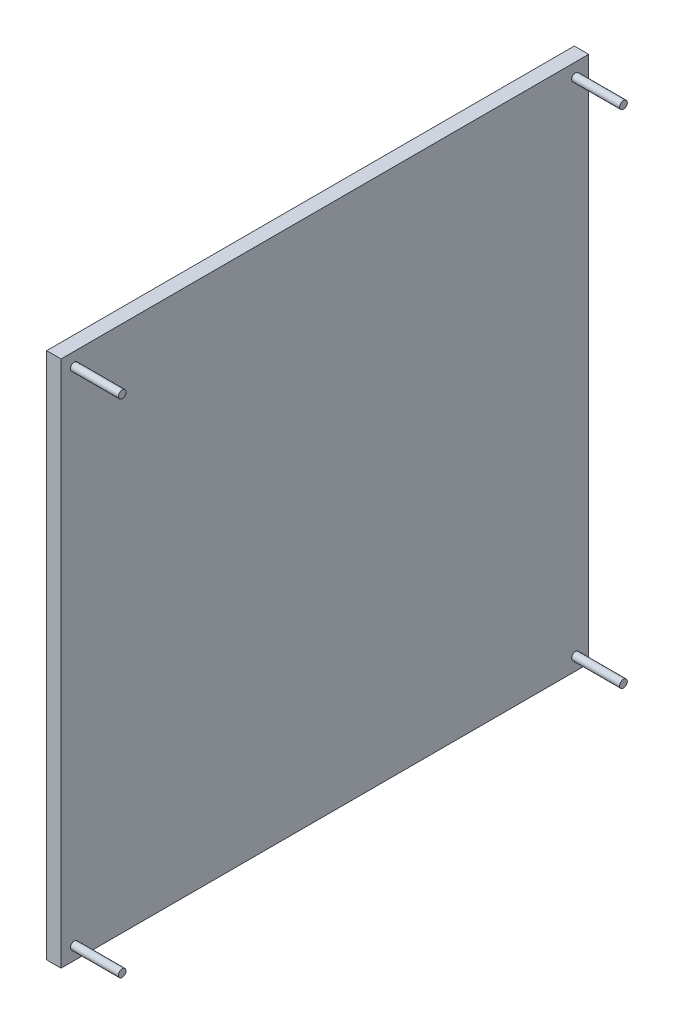
ISO-10303-21;
HEADER;
FILE_DESCRIPTION(('STEP AP214'),'2;1');
FILE_NAME('part.step','',(''),(''),'','','');
FILE_SCHEMA(('AUTOMOTIVE_DESIGN { 1 0 10303 214 1 1 1 1 }'));
ENDSEC;
DATA;
#1=APPLICATION_CONTEXT('core data for automotive mechanical design processes');
#2=APPLICATION_PROTOCOL_DEFINITION('international standard','automotive_design',2000,#1);
#3=PRODUCT_CONTEXT('',#1,'mechanical');
#4=PRODUCT('Part','Part','',(#3));
#5=PRODUCT_RELATED_PRODUCT_CATEGORY('part','',(#4));
#6=PRODUCT_DEFINITION_FORMATION('','',#4);
#7=PRODUCT_DEFINITION_CONTEXT('part definition',#1,'design');
#8=PRODUCT_DEFINITION('design','',#6,#7);
#9=PRODUCT_DEFINITION_SHAPE('','',#8);
#10=(LENGTH_UNIT() NAMED_UNIT(*) SI_UNIT(.MILLI.,.METRE.));
#11=(NAMED_UNIT(*) PLANE_ANGLE_UNIT() SI_UNIT($,.RADIAN.));
#12=(NAMED_UNIT(*) SI_UNIT($,.STERADIAN.) SOLID_ANGLE_UNIT());
#13=UNCERTAINTY_MEASURE_WITH_UNIT(LENGTH_MEASURE(1.E-05),#10,'distance_accuracy_value','');
#14=(GEOMETRIC_REPRESENTATION_CONTEXT(3) GLOBAL_UNCERTAINTY_ASSIGNED_CONTEXT((#13)) GLOBAL_UNIT_ASSIGNED_CONTEXT((#10,
#11,#12)) REPRESENTATION_CONTEXT('',''));
#15=CARTESIAN_POINT('',(0.,0.,0.));
#16=DIRECTION('',(0.,0.,1.));
#17=DIRECTION('',(1.,0.,0.));
#18=AXIS2_PLACEMENT_3D('',#15,#16,#17);
#19=CARTESIAN_POINT('',(6.,0.,0.));
#20=DIRECTION('',(-1.,0.,0.));
#21=DIRECTION('',(0.,0.,1.));
#22=AXIS2_PLACEMENT_3D('',#19,#20,#21);
#23=PLANE('',#22);
#24=DIRECTION('',(0.,1.,0.));
#25=VECTOR('',#24,1.);
#26=CARTESIAN_POINT('',(6.,125.424234720645,-86.795399092835));
#27=LINE('',#26,#25);
#28=CARTESIAN_POINT('',(6.,-94.575765279355,-86.795399092835));
#29=VERTEX_POINT('',#28);
#30=CARTESIAN_POINT('',(6.,125.424234720645,-86.795399092835));
#31=VERTEX_POINT('',#30);
#32=EDGE_CURVE('E86',#29,#31,#27,.T.);
#33=ORIENTED_EDGE('',*,*,#32,.T.);
#34=DIRECTION('',(0.,0.,1.));
#35=VECTOR('',#34,1.);
#36=CARTESIAN_POINT('',(6.,125.424234720645,-86.795399092835));
#37=LINE('',#36,#35);
#38=CARTESIAN_POINT('',(6.,125.424234720645,133.204600907165));
#39=VERTEX_POINT('',#38);
#40=EDGE_CURVE('E81',#31,#39,#37,.T.);
#41=ORIENTED_EDGE('',*,*,#40,.T.);
#42=DIRECTION('',(0.,-1.,0.));
#43=VECTOR('',#42,1.);
#44=CARTESIAN_POINT('',(6.,125.424234720645,133.204600907165));
#45=LINE('',#44,#43);
#46=CARTESIAN_POINT('',(6.,-94.575765279355,133.204600907165));
#47=VERTEX_POINT('',#46);
#48=EDGE_CURVE('E84',#39,#47,#45,.T.);
#49=ORIENTED_EDGE('',*,*,#48,.T.);
#50=DIRECTION('',(0.,0.,-1.));
#51=VECTOR('',#50,1.);
#52=CARTESIAN_POINT('',(6.,-94.575765279355,-86.795399092835));
#53=LINE('',#52,#51);
#54=EDGE_CURVE('E51',#47,#29,#53,.T.);
#55=ORIENTED_EDGE('',*,*,#54,.T.);
#56=EDGE_LOOP('',(#33,#41,#49,#55));
#57=FACE_BOUND('',#56,.T.);
#58=CARTESIAN_POINT('',(6.,119.924234720645,-81.295399092835));
#59=DIRECTION('',(1.,0.,0.));
#60=DIRECTION('',(0.,0.,-1.));
#61=AXIS2_PLACEMENT_3D('',#58,#59,#60);
#62=CIRCLE('',#61,1.60000000000002);
#63=CARTESIAN_POINT('',(6.,119.924234720645,-82.895399092835));
#64=VERTEX_POINT('',#63);
#65=EDGE_CURVE('E101',#64,#64,#62,.T.);
#66=ORIENTED_EDGE('',*,*,#65,.F.);
#67=EDGE_LOOP('',(#66));
#68=FACE_BOUND('',#67,.T.);
#69=CARTESIAN_POINT('',(6.,119.924234720645,127.704600907165));
#70=DIRECTION('',(1.,0.,0.));
#71=DIRECTION('',(0.,0.,-1.));
#72=AXIS2_PLACEMENT_3D('',#69,#70,#71);
#73=CIRCLE('',#72,1.60000000000002);
#74=CARTESIAN_POINT('',(6.,119.924234720645,126.104600907165));
#75=VERTEX_POINT('',#74);
#76=EDGE_CURVE('E114',#75,#75,#73,.T.);
#77=ORIENTED_EDGE('',*,*,#76,.F.);
#78=EDGE_LOOP('',(#77));
#79=FACE_BOUND('',#78,.T.);
#80=CARTESIAN_POINT('',(6.,-89.075765279355,127.704600907165));
#81=DIRECTION('',(1.,0.,0.));
#82=DIRECTION('',(0.,0.,-1.));
#83=AXIS2_PLACEMENT_3D('',#80,#81,#82);
#84=CIRCLE('',#83,1.60000000000002);
#85=CARTESIAN_POINT('',(6.,-89.075765279355,126.104600907165));
#86=VERTEX_POINT('',#85);
#87=EDGE_CURVE('E117',#86,#86,#84,.T.);
#88=ORIENTED_EDGE('',*,*,#87,.F.);
#89=EDGE_LOOP('',(#88));
#90=FACE_BOUND('',#89,.T.);
#91=CARTESIAN_POINT('',(6.,-89.075765279355,-81.2953990928351));
#92=DIRECTION('',(1.,0.,0.));
#93=DIRECTION('',(0.,0.,-1.));
#94=AXIS2_PLACEMENT_3D('',#91,#92,#93);
#95=CIRCLE('',#94,1.60000000000002);
#96=CARTESIAN_POINT('',(6.,-89.075765279355,-82.8953990928351));
#97=VERTEX_POINT('',#96);
#98=EDGE_CURVE('E120',#97,#97,#95,.T.);
#99=ORIENTED_EDGE('',*,*,#98,.F.);
#100=EDGE_LOOP('',(#99));
#101=FACE_BOUND('',#100,.T.);
#102=ADVANCED_FACE('F34',(#57,#68,#79,#90,#101),#23,.F.);
#103=CARTESIAN_POINT('',(0.,0.,0.));
#104=DIRECTION('',(-1.,0.,0.));
#105=DIRECTION('',(0.,0.,1.));
#106=AXIS2_PLACEMENT_3D('',#103,#104,#105);
#107=PLANE('',#106);
#108=DIRECTION('',(0.,1.,0.));
#109=VECTOR('',#108,1.);
#110=CARTESIAN_POINT('',(0.,125.424234720645,-86.795399092835));
#111=LINE('',#110,#109);
#112=CARTESIAN_POINT('',(0.,-94.575765279355,-86.795399092835));
#113=VERTEX_POINT('',#112);
#114=CARTESIAN_POINT('',(0.,125.424234720645,-86.795399092835));
#115=VERTEX_POINT('',#114);
#116=EDGE_CURVE('E98',#113,#115,#111,.T.);
#117=ORIENTED_EDGE('',*,*,#116,.F.);
#118=DIRECTION('',(0.,0.,-1.));
#119=VECTOR('',#118,1.);
#120=CARTESIAN_POINT('',(0.,-94.575765279355,-86.795399092835));
#121=LINE('',#120,#119);
#122=CARTESIAN_POINT('',(0.,-94.575765279355,133.204600907165));
#123=VERTEX_POINT('',#122);
#124=EDGE_CURVE('E74',#123,#113,#121,.T.);
#125=ORIENTED_EDGE('',*,*,#124,.F.);
#126=DIRECTION('',(0.,-1.,0.));
#127=VECTOR('',#126,1.);
#128=CARTESIAN_POINT('',(0.,125.424234720645,133.204600907165));
#129=LINE('',#128,#127);
#130=CARTESIAN_POINT('',(0.,125.424234720645,133.204600907165));
#131=VERTEX_POINT('',#130);
#132=EDGE_CURVE('E68',#131,#123,#129,.T.);
#133=ORIENTED_EDGE('',*,*,#132,.F.);
#134=DIRECTION('',(0.,0.,1.));
#135=VECTOR('',#134,1.);
#136=CARTESIAN_POINT('',(0.,125.424234720645,-86.795399092835));
#137=LINE('',#136,#135);
#138=EDGE_CURVE('E90',#115,#131,#137,.T.);
#139=ORIENTED_EDGE('',*,*,#138,.F.);
#140=EDGE_LOOP('',(#117,#125,#133,#139));
#141=FACE_BOUND('',#140,.T.);
#142=ADVANCED_FACE('F109',(#141),#107,.T.);
#143=CARTESIAN_POINT('',(6.,125.424234720645,-86.795399092835));
#144=DIRECTION('',(0.,0.,1.));
#145=DIRECTION('',(0.,-1.,0.));
#146=AXIS2_PLACEMENT_3D('',#143,#144,#145);
#147=PLANE('',#146);
#148=ORIENTED_EDGE('',*,*,#116,.T.);
#149=DIRECTION('',(-1.,0.,0.));
#150=VECTOR('',#149,1.);
#151=CARTESIAN_POINT('',(6.,125.424234720645,-86.795399092835));
#152=LINE('',#151,#150);
#153=EDGE_CURVE('E11',#31,#115,#152,.T.);
#154=ORIENTED_EDGE('',*,*,#153,.F.);
#155=ORIENTED_EDGE('',*,*,#32,.F.);
#156=DIRECTION('',(-1.,0.,0.));
#157=VECTOR('',#156,1.);
#158=CARTESIAN_POINT('',(6.,-94.575765279355,-86.795399092835));
#159=LINE('',#158,#157);
#160=EDGE_CURVE('E94',#29,#113,#159,.T.);
#161=ORIENTED_EDGE('',*,*,#160,.T.);
#162=EDGE_LOOP('',(#148,#154,#155,#161));
#163=FACE_BOUND('',#162,.T.);
#164=ADVANCED_FACE('F36',(#163),#147,.F.);
#165=CARTESIAN_POINT('',(6.,125.424234720645,-86.795399092835));
#166=DIRECTION('',(0.,-1.,0.));
#167=DIRECTION('',(0.,0.,-1.));
#168=AXIS2_PLACEMENT_3D('',#165,#166,#167);
#169=PLANE('',#168);
#170=ORIENTED_EDGE('',*,*,#138,.T.);
#171=DIRECTION('',(-1.,0.,0.));
#172=VECTOR('',#171,1.);
#173=CARTESIAN_POINT('',(6.,125.424234720645,133.204600907165));
#174=LINE('',#173,#172);
#175=EDGE_CURVE('E43',#39,#131,#174,.T.);
#176=ORIENTED_EDGE('',*,*,#175,.F.);
#177=ORIENTED_EDGE('',*,*,#40,.F.);
#178=ORIENTED_EDGE('',*,*,#153,.T.);
#179=EDGE_LOOP('',(#170,#176,#177,#178));
#180=FACE_BOUND('',#179,.T.);
#181=ADVANCED_FACE('F89',(#180),#169,.F.);
#182=CARTESIAN_POINT('',(6.,125.424234720645,133.204600907165));
#183=DIRECTION('',(0.,0.,-1.));
#184=DIRECTION('',(0.,1.,0.));
#185=AXIS2_PLACEMENT_3D('',#182,#183,#184);
#186=PLANE('',#185);
#187=ORIENTED_EDGE('',*,*,#132,.T.);
#188=DIRECTION('',(-1.,0.,0.));
#189=VECTOR('',#188,1.);
#190=CARTESIAN_POINT('',(6.,-94.575765279355,133.204600907165));
#191=LINE('',#190,#189);
#192=EDGE_CURVE('E91',#47,#123,#191,.T.);
#193=ORIENTED_EDGE('',*,*,#192,.F.);
#194=ORIENTED_EDGE('',*,*,#48,.F.);
#195=ORIENTED_EDGE('',*,*,#175,.T.);
#196=EDGE_LOOP('',(#187,#193,#194,#195));
#197=FACE_BOUND('',#196,.T.);
#198=ADVANCED_FACE('F92',(#197),#186,.F.);
#199=CARTESIAN_POINT('',(6.,-94.575765279355,-86.795399092835));
#200=DIRECTION('',(0.,1.,0.));
#201=DIRECTION('',(0.,0.,1.));
#202=AXIS2_PLACEMENT_3D('',#199,#200,#201);
#203=PLANE('',#202);
#204=ORIENTED_EDGE('',*,*,#124,.T.);
#205=ORIENTED_EDGE('',*,*,#160,.F.);
#206=ORIENTED_EDGE('',*,*,#54,.F.);
#207=ORIENTED_EDGE('',*,*,#192,.T.);
#208=EDGE_LOOP('',(#204,#205,#206,#207));
#209=FACE_BOUND('',#208,.T.);
#210=ADVANCED_FACE('F106',(#209),#203,.F.);
#211=CARTESIAN_POINT('',(0.,-89.075765279355,-81.2953990928351));
#212=DIRECTION('',(1.,0.,0.));
#213=DIRECTION('',(0.,0.,-1.));
#214=AXIS2_PLACEMENT_3D('',#211,#212,#213);
#215=CYLINDRICAL_SURFACE('',#214,1.60000000000002);
#216=CARTESIAN_POINT('',(26.,-89.075765279355,-81.2953990928351));
#217=DIRECTION('',(1.,0.,0.));
#218=DIRECTION('',(0.,0.,-1.));
#219=AXIS2_PLACEMENT_3D('',#216,#217,#218);
#220=CIRCLE('',#219,1.60000000000002);
#221=CARTESIAN_POINT('',(26.,-89.075765279355,-82.8953990928351));
#222=VERTEX_POINT('',#221);
#223=EDGE_CURVE('E123',#222,#222,#220,.T.);
#224=ORIENTED_EDGE('',*,*,#223,.F.);
#225=EDGE_LOOP('',(#224));
#226=FACE_BOUND('',#225,.T.);
#227=ORIENTED_EDGE('',*,*,#98,.T.);
#228=EDGE_LOOP('',(#227));
#229=FACE_BOUND('',#228,.T.);
#230=ADVANCED_FACE('F152',(#226,#229),#215,.T.);
#231=CARTESIAN_POINT('',(26.,-89.075765279355,-81.2953990928351));
#232=DIRECTION('',(1.,0.,0.));
#233=DIRECTION('',(0.,0.,-1.));
#234=AXIS2_PLACEMENT_3D('',#231,#232,#233);
#235=PLANE('',#234);
#236=ORIENTED_EDGE('',*,*,#223,.T.);
#237=EDGE_LOOP('',(#236));
#238=FACE_BOUND('',#237,.T.);
#239=ADVANCED_FACE('F154',(#238),#235,.T.);
#240=CARTESIAN_POINT('',(0.,-89.075765279355,127.704600907165));
#241=DIRECTION('',(1.,0.,0.));
#242=DIRECTION('',(0.,0.,-1.));
#243=AXIS2_PLACEMENT_3D('',#240,#241,#242);
#244=CYLINDRICAL_SURFACE('',#243,1.60000000000002);
#245=CARTESIAN_POINT('',(26.,-89.075765279355,127.704600907165));
#246=DIRECTION('',(1.,0.,0.));
#247=DIRECTION('',(0.,0.,-1.));
#248=AXIS2_PLACEMENT_3D('',#245,#246,#247);
#249=CIRCLE('',#248,1.60000000000002);
#250=CARTESIAN_POINT('',(26.,-89.075765279355,126.104600907165));
#251=VERTEX_POINT('',#250);
#252=EDGE_CURVE('E126',#251,#251,#249,.T.);
#253=ORIENTED_EDGE('',*,*,#252,.F.);
#254=EDGE_LOOP('',(#253));
#255=FACE_BOUND('',#254,.T.);
#256=ORIENTED_EDGE('',*,*,#87,.T.);
#257=EDGE_LOOP('',(#256));
#258=FACE_BOUND('',#257,.T.);
#259=ADVANCED_FACE('F161',(#255,#258),#244,.T.);
#260=CARTESIAN_POINT('',(26.,-89.075765279355,127.704600907165));
#261=DIRECTION('',(1.,0.,0.));
#262=DIRECTION('',(0.,0.,-1.));
#263=AXIS2_PLACEMENT_3D('',#260,#261,#262);
#264=PLANE('',#263);
#265=ORIENTED_EDGE('',*,*,#252,.T.);
#266=EDGE_LOOP('',(#265));
#267=FACE_BOUND('',#266,.T.);
#268=ADVANCED_FACE('F236',(#267),#264,.T.);
#269=CARTESIAN_POINT('',(0.,119.924234720645,-81.295399092835));
#270=DIRECTION('',(1.,0.,0.));
#271=DIRECTION('',(0.,0.,-1.));
#272=AXIS2_PLACEMENT_3D('',#269,#270,#271);
#273=CYLINDRICAL_SURFACE('',#272,1.60000000000002);
#274=CARTESIAN_POINT('',(26.,119.924234720645,-81.295399092835));
#275=DIRECTION('',(1.,0.,0.));
#276=DIRECTION('',(0.,0.,-1.));
#277=AXIS2_PLACEMENT_3D('',#274,#275,#276);
#278=CIRCLE('',#277,1.60000000000002);
#279=CARTESIAN_POINT('',(26.,119.924234720645,-82.895399092835));
#280=VERTEX_POINT('',#279);
#281=EDGE_CURVE('E129',#280,#280,#278,.T.);
#282=ORIENTED_EDGE('',*,*,#281,.F.);
#283=EDGE_LOOP('',(#282));
#284=FACE_BOUND('',#283,.T.);
#285=ORIENTED_EDGE('',*,*,#65,.T.);
#286=EDGE_LOOP('',(#285));
#287=FACE_BOUND('',#286,.T.);
#288=ADVANCED_FACE('F244',(#284,#287),#273,.T.);
#289=CARTESIAN_POINT('',(26.,119.924234720645,-81.295399092835));
#290=DIRECTION('',(1.,0.,0.));
#291=DIRECTION('',(0.,0.,-1.));
#292=AXIS2_PLACEMENT_3D('',#289,#290,#291);
#293=PLANE('',#292);
#294=ORIENTED_EDGE('',*,*,#281,.T.);
#295=EDGE_LOOP('',(#294));
#296=FACE_BOUND('',#295,.T.);
#297=ADVANCED_FACE('F141',(#296),#293,.T.);
#298=CARTESIAN_POINT('',(0.,119.924234720645,127.704600907165));
#299=DIRECTION('',(1.,0.,0.));
#300=DIRECTION('',(0.,0.,-1.));
#301=AXIS2_PLACEMENT_3D('',#298,#299,#300);
#302=CYLINDRICAL_SURFACE('',#301,1.60000000000002);
#303=CARTESIAN_POINT('',(26.,119.924234720645,127.704600907165));
#304=DIRECTION('',(1.,0.,0.));
#305=DIRECTION('',(0.,0.,-1.));
#306=AXIS2_PLACEMENT_3D('',#303,#304,#305);
#307=CIRCLE('',#306,1.60000000000002);
#308=CARTESIAN_POINT('',(26.,119.924234720645,126.104600907165));
#309=VERTEX_POINT('',#308);
#310=EDGE_CURVE('E132',#309,#309,#307,.T.);
#311=ORIENTED_EDGE('',*,*,#310,.F.);
#312=EDGE_LOOP('',(#311));
#313=FACE_BOUND('',#312,.T.);
#314=ORIENTED_EDGE('',*,*,#76,.T.);
#315=EDGE_LOOP('',(#314));
#316=FACE_BOUND('',#315,.T.);
#317=ADVANCED_FACE('F138',(#313,#316),#302,.T.);
#318=CARTESIAN_POINT('',(26.,119.924234720645,127.704600907165));
#319=DIRECTION('',(1.,0.,0.));
#320=DIRECTION('',(0.,0.,-1.));
#321=AXIS2_PLACEMENT_3D('',#318,#319,#320);
#322=PLANE('',#321);
#323=ORIENTED_EDGE('',*,*,#310,.T.);
#324=EDGE_LOOP('',(#323));
#325=FACE_BOUND('',#324,.T.);
#326=ADVANCED_FACE('F136',(#325),#322,.T.);
#327=CLOSED_SHELL('',(#102,#142,#164,#181,#198,#210,#230,#239,#259,#268,#288,#297,#317,#326));
#328=MANIFOLD_SOLID_BREP('B2',#327);
#329=ADVANCED_BREP_SHAPE_REPRESENTATION('',(#18,#328),#14);
#330=SHAPE_DEFINITION_REPRESENTATION(#9,#329);
ENDSEC;
END-ISO-10303-21;
